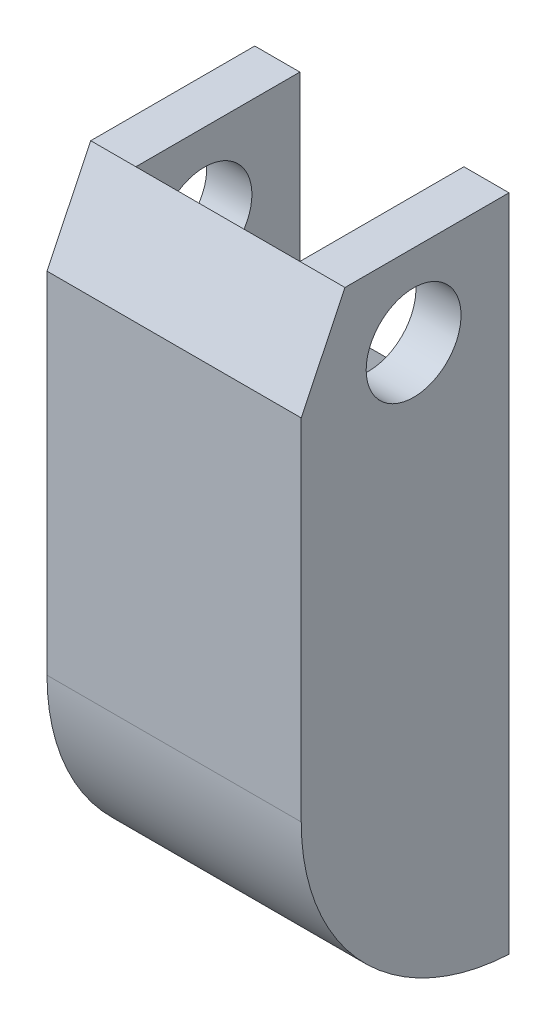
ISO-10303-21;
HEADER;
FILE_DESCRIPTION(('STEP AP214'),'2;1');
FILE_NAME('part.step','',(''),(''),'','','');
FILE_SCHEMA(('AUTOMOTIVE_DESIGN { 1 0 10303 214 1 1 1 1 }'));
ENDSEC;
DATA;
#1=APPLICATION_CONTEXT('core data for automotive mechanical design processes');
#2=APPLICATION_PROTOCOL_DEFINITION('international standard','automotive_design',2000,#1);
#3=PRODUCT_CONTEXT('',#1,'mechanical');
#4=PRODUCT('Part','Part','',(#3));
#5=PRODUCT_RELATED_PRODUCT_CATEGORY('part','',(#4));
#6=PRODUCT_DEFINITION_FORMATION('','',#4);
#7=PRODUCT_DEFINITION_CONTEXT('part definition',#1,'design');
#8=PRODUCT_DEFINITION('design','',#6,#7);
#9=PRODUCT_DEFINITION_SHAPE('','',#8);
#10=(LENGTH_UNIT() NAMED_UNIT(*) SI_UNIT(.MILLI.,.METRE.));
#11=(NAMED_UNIT(*) PLANE_ANGLE_UNIT() SI_UNIT($,.RADIAN.));
#12=(NAMED_UNIT(*) SI_UNIT($,.STERADIAN.) SOLID_ANGLE_UNIT());
#13=UNCERTAINTY_MEASURE_WITH_UNIT(LENGTH_MEASURE(1.E-05),#10,'distance_accuracy_value','');
#14=(GEOMETRIC_REPRESENTATION_CONTEXT(3) GLOBAL_UNCERTAINTY_ASSIGNED_CONTEXT((#13)) GLOBAL_UNIT_ASSIGNED_CONTEXT((#10,
#11,#12)) REPRESENTATION_CONTEXT('',''));
#15=CARTESIAN_POINT('',(0.,0.,0.));
#16=DIRECTION('',(0.,0.,1.));
#17=DIRECTION('',(1.,0.,0.));
#18=AXIS2_PLACEMENT_3D('',#15,#16,#17);
#19=CARTESIAN_POINT('',(0.,0.,7.62));
#20=DIRECTION('',(0.,0.,-1.));
#21=DIRECTION('',(-1.,0.,0.));
#22=AXIS2_PLACEMENT_3D('',#19,#20,#21);
#23=PLANE('',#22);
#24=DIRECTION('',(0.,-1.,0.));
#25=VECTOR('',#24,1.);
#26=CARTESIAN_POINT('',(9.7155,45.98924,7.62));
#27=LINE('',#26,#25);
#28=CARTESIAN_POINT('',(9.7155,30.63494,7.62));
#29=VERTEX_POINT('',#28);
#30=CARTESIAN_POINT('',(9.7155,26.82494,7.62));
#31=VERTEX_POINT('',#30);
#32=EDGE_CURVE('E188',#29,#31,#27,.T.);
#33=ORIENTED_EDGE('',*,*,#32,.T.);
#34=DIRECTION('',(1.,0.,0.));
#35=VECTOR('',#34,1.);
#36=CARTESIAN_POINT('',(-1.93222127853173,26.82494,7.62));
#37=LINE('',#36,#35);
#38=CARTESIAN_POINT('',(2.0955,26.82494,7.62));
#39=VERTEX_POINT('',#38);
#40=EDGE_CURVE('E141',#39,#31,#37,.T.);
#41=ORIENTED_EDGE('',*,*,#40,.F.);
#42=DIRECTION('',(0.,1.,0.));
#43=VECTOR('',#42,1.);
#44=CARTESIAN_POINT('',(2.0955,45.98924,7.62));
#45=LINE('',#44,#43);
#46=CARTESIAN_POINT('',(2.0955,30.63494,7.62));
#47=VERTEX_POINT('',#46);
#48=EDGE_CURVE('E146',#39,#47,#45,.T.);
#49=ORIENTED_EDGE('',*,*,#48,.T.);
#50=DIRECTION('',(-1.,0.,0.));
#51=VECTOR('',#50,1.);
#52=CARTESIAN_POINT('',(0.,30.63494,7.62));
#53=LINE('',#52,#51);
#54=EDGE_CURVE('E12',#29,#47,#53,.T.);
#55=ORIENTED_EDGE('',*,*,#54,.F.);
#56=EDGE_LOOP('',(#33,#41,#49,#55));
#57=FACE_BOUND('',#56,.T.);
#58=ADVANCED_FACE('F43',(#57),#23,.T.);
#59=CARTESIAN_POINT('',(11.811,0.,9.652));
#60=DIRECTION('',(-1.,0.,0.));
#61=DIRECTION('',(0.,0.,1.));
#62=AXIS2_PLACEMENT_3D('',#59,#60,#61);
#63=PLANE('',#62);
#64=CARTESIAN_POINT('',(11.811,26.82494,4.4323));
#65=DIRECTION('',(-1.,0.,0.));
#66=DIRECTION('',(0.,0.,1.));
#67=AXIS2_PLACEMENT_3D('',#64,#65,#66);
#68=CIRCLE('',#67,2.20345);
#69=CARTESIAN_POINT('',(11.811,26.82494,6.63575));
#70=VERTEX_POINT('',#69);
#71=EDGE_CURVE('E177',#70,#70,#68,.T.);
#72=ORIENTED_EDGE('',*,*,#71,.T.);
#73=EDGE_LOOP('',(#72));
#74=FACE_BOUND('',#73,.T.);
#75=DIRECTION('',(0.,1.,0.));
#76=VECTOR('',#75,1.);
#77=CARTESIAN_POINT('',(11.811,0.,0.));
#78=LINE('',#77,#76);
#79=CARTESIAN_POINT('',(11.811,0.,0.));
#80=VERTEX_POINT('',#79);
#81=CARTESIAN_POINT('',(11.811,30.63494,0.));
#82=VERTEX_POINT('',#81);
#83=EDGE_CURVE('E205',#80,#82,#78,.T.);
#84=ORIENTED_EDGE('',*,*,#83,.T.);
#85=DIRECTION('',(0.,0.,-1.));
#86=VECTOR('',#85,1.);
#87=CARTESIAN_POINT('',(11.811,30.63494,7.62));
#88=LINE('',#87,#86);
#89=CARTESIAN_POINT('',(11.811,30.63494,7.62));
#90=VERTEX_POINT('',#89);
#91=EDGE_CURVE('E158',#90,#82,#88,.T.);
#92=ORIENTED_EDGE('',*,*,#91,.F.);
#93=DIRECTION('',(0.,0.901435014436661,-0.432914442756968));
#94=VECTOR('',#93,1.);
#95=CARTESIAN_POINT('',(11.811,26.4038130880166,9.652));
#96=LINE('',#95,#94);
#97=CARTESIAN_POINT('',(11.811,26.4038130880166,9.652));
#98=VERTEX_POINT('',#97);
#99=EDGE_CURVE('E153',#98,#90,#96,.T.);
#100=ORIENTED_EDGE('',*,*,#99,.F.);
#101=DIRECTION('',(0.,1.,0.));
#102=VECTOR('',#101,1.);
#103=CARTESIAN_POINT('',(11.811,0.,9.652));
#104=LINE('',#103,#102);
#105=CARTESIAN_POINT('',(11.811,10.1472920525626,9.652));
#106=VERTEX_POINT('',#105);
#107=EDGE_CURVE('E196',#106,#98,#104,.T.);
#108=ORIENTED_EDGE('',*,*,#107,.F.);
#109=CARTESIAN_POINT('',(11.811,10.1472920525626,-0.508000000000002));
#110=DIRECTION('',(-1.,0.,0.));
#111=DIRECTION('',(0.,0.,1.));
#112=AXIS2_PLACEMENT_3D('',#109,#110,#111);
#113=CIRCLE('',#112,10.16);
#114=EDGE_CURVE('E214',#106,#80,#113,.F.);
#115=ORIENTED_EDGE('',*,*,#114,.T.);
#116=EDGE_LOOP('',(#84,#92,#100,#108,#115));
#117=FACE_BOUND('',#116,.T.);
#118=ADVANCED_FACE('F218',(#74,#117),#63,.F.);
#119=CARTESIAN_POINT('',(0.,0.,9.652));
#120=DIRECTION('',(-1.,0.,0.));
#121=DIRECTION('',(0.,0.,1.));
#122=AXIS2_PLACEMENT_3D('',#119,#120,#121);
#123=PLANE('',#122);
#124=DIRECTION('',(0.,0.,-1.));
#125=VECTOR('',#124,1.);
#126=CARTESIAN_POINT('',(0.,30.63494,7.62));
#127=LINE('',#126,#125);
#128=CARTESIAN_POINT('',(0.,30.63494,7.62));
#129=VERTEX_POINT('',#128);
#130=CARTESIAN_POINT('',(0.,30.63494,0.));
#131=VERTEX_POINT('',#130);
#132=EDGE_CURVE('E157',#129,#131,#127,.T.);
#133=ORIENTED_EDGE('',*,*,#132,.T.);
#134=DIRECTION('',(0.,1.,0.));
#135=VECTOR('',#134,1.);
#136=CARTESIAN_POINT('',(0.,0.,0.));
#137=LINE('',#136,#135);
#138=CARTESIAN_POINT('',(0.,0.,0.));
#139=VERTEX_POINT('',#138);
#140=EDGE_CURVE('E200',#139,#131,#137,.T.);
#141=ORIENTED_EDGE('',*,*,#140,.F.);
#142=CARTESIAN_POINT('',(0.,10.1472920525626,-0.508000000000002));
#143=DIRECTION('',(-1.,0.,0.));
#144=DIRECTION('',(0.,0.,1.));
#145=AXIS2_PLACEMENT_3D('',#142,#143,#144);
#146=CIRCLE('',#145,10.16);
#147=CARTESIAN_POINT('',(0.,10.1472920525626,9.652));
#148=VERTEX_POINT('',#147);
#149=EDGE_CURVE('E51',#139,#148,#146,.T.);
#150=ORIENTED_EDGE('',*,*,#149,.T.);
#151=DIRECTION('',(0.,1.,0.));
#152=VECTOR('',#151,1.);
#153=CARTESIAN_POINT('',(0.,0.,9.652));
#154=LINE('',#153,#152);
#155=CARTESIAN_POINT('',(0.,26.4038130880166,9.652));
#156=VERTEX_POINT('',#155);
#157=EDGE_CURVE('E199',#148,#156,#154,.T.);
#158=ORIENTED_EDGE('',*,*,#157,.T.);
#159=DIRECTION('',(0.,0.901435014436661,-0.432914442756968));
#160=VECTOR('',#159,1.);
#161=CARTESIAN_POINT('',(0.,26.4038130880166,9.652));
#162=LINE('',#161,#160);
#163=EDGE_CURVE('E154',#156,#129,#162,.T.);
#164=ORIENTED_EDGE('',*,*,#163,.T.);
#165=EDGE_LOOP('',(#133,#141,#150,#158,#164));
#166=FACE_BOUND('',#165,.T.);
#167=CARTESIAN_POINT('',(0.,26.82494,4.4323));
#168=DIRECTION('',(-1.,0.,0.));
#169=DIRECTION('',(0.,0.,1.));
#170=AXIS2_PLACEMENT_3D('',#167,#168,#169);
#171=CIRCLE('',#170,2.20345);
#172=CARTESIAN_POINT('',(0.,26.82494,6.63575));
#173=VERTEX_POINT('',#172);
#174=EDGE_CURVE('E184',#173,#173,#171,.T.);
#175=ORIENTED_EDGE('',*,*,#174,.F.);
#176=EDGE_LOOP('',(#175));
#177=FACE_BOUND('',#176,.T.);
#178=ADVANCED_FACE('F230',(#166,#177),#123,.T.);
#179=CARTESIAN_POINT('',(0.,0.,9.652));
#180=DIRECTION('',(0.,0.,1.));
#181=DIRECTION('',(1.,0.,0.));
#182=AXIS2_PLACEMENT_3D('',#179,#180,#181);
#183=PLANE('',#182);
#184=DIRECTION('',(1.,0.,0.));
#185=VECTOR('',#184,1.);
#186=CARTESIAN_POINT('',(0.,26.4038130880166,9.652));
#187=LINE('',#186,#185);
#188=EDGE_CURVE('E161',#156,#98,#187,.T.);
#189=ORIENTED_EDGE('',*,*,#188,.F.);
#190=ORIENTED_EDGE('',*,*,#157,.F.);
#191=DIRECTION('',(-1.,0.,0.));
#192=VECTOR('',#191,1.);
#193=CARTESIAN_POINT('',(11.811,10.1472920525626,9.652));
#194=LINE('',#193,#192);
#195=EDGE_CURVE('E202',#148,#106,#194,.F.);
#196=ORIENTED_EDGE('',*,*,#195,.T.);
#197=ORIENTED_EDGE('',*,*,#107,.T.);
#198=EDGE_LOOP('',(#189,#190,#196,#197));
#199=FACE_BOUND('',#198,.T.);
#200=ADVANCED_FACE('F229',(#199),#183,.T.);
#201=CARTESIAN_POINT('',(0.,0.,0.));
#202=DIRECTION('',(0.,0.,1.));
#203=DIRECTION('',(1.,0.,0.));
#204=AXIS2_PLACEMENT_3D('',#201,#202,#203);
#205=PLANE('',#204);
#206=DIRECTION('',(0.,1.,0.));
#207=VECTOR('',#206,1.);
#208=CARTESIAN_POINT('',(2.0955,45.98924,0.));
#209=LINE('',#208,#207);
#210=CARTESIAN_POINT('',(2.0955,21.1600760854083,0.));
#211=VERTEX_POINT('',#210);
#212=CARTESIAN_POINT('',(2.0955,30.63494,0.));
#213=VERTEX_POINT('',#212);
#214=EDGE_CURVE('E191',#211,#213,#209,.T.);
#215=ORIENTED_EDGE('',*,*,#214,.F.);
#216=DIRECTION('',(1.,0.,0.));
#217=VECTOR('',#216,1.);
#218=CARTESIAN_POINT('',(-3.6265634608912,21.1600760854083,0.));
#219=LINE('',#218,#217);
#220=CARTESIAN_POINT('',(9.7155,21.1600760854083,0.));
#221=VERTEX_POINT('',#220);
#222=EDGE_CURVE('E129',#211,#221,#219,.T.);
#223=ORIENTED_EDGE('',*,*,#222,.T.);
#224=DIRECTION('',(0.,-1.,0.));
#225=VECTOR('',#224,1.);
#226=CARTESIAN_POINT('',(9.7155,45.98924,0.));
#227=LINE('',#226,#225);
#228=CARTESIAN_POINT('',(9.7155,30.63494,0.));
#229=VERTEX_POINT('',#228);
#230=EDGE_CURVE('E187',#229,#221,#227,.T.);
#231=ORIENTED_EDGE('',*,*,#230,.F.);
#232=DIRECTION('',(1.,0.,0.));
#233=VECTOR('',#232,1.);
#234=CARTESIAN_POINT('',(0.,30.63494,0.));
#235=LINE('',#234,#233);
#236=EDGE_CURVE('E168',#229,#82,#235,.T.);
#237=ORIENTED_EDGE('',*,*,#236,.T.);
#238=ORIENTED_EDGE('',*,*,#83,.F.);
#239=DIRECTION('',(1.,0.,0.));
#240=VECTOR('',#239,1.);
#241=CARTESIAN_POINT('',(0.,0.,0.));
#242=LINE('',#241,#240);
#243=EDGE_CURVE('E193',#139,#80,#242,.T.);
#244=ORIENTED_EDGE('',*,*,#243,.F.);
#245=ORIENTED_EDGE('',*,*,#140,.T.);
#246=EDGE_CURVE('E164',#131,#213,#235,.T.);
#247=ORIENTED_EDGE('',*,*,#246,.T.);
#248=EDGE_LOOP('',(#215,#223,#231,#237,#238,#244,#245,#247));
#249=FACE_BOUND('',#248,.T.);
#250=ADVANCED_FACE('F225',(#249),#205,.F.);
#251=CARTESIAN_POINT('',(9.7155,45.98924,7.62));
#252=DIRECTION('',(1.,0.,0.));
#253=DIRECTION('',(0.,1.,0.));
#254=AXIS2_PLACEMENT_3D('',#251,#252,#253);
#255=PLANE('',#254);
#256=CARTESIAN_POINT('',(9.7155,26.82494,4.4323));
#257=DIRECTION('',(1.,0.,0.));
#258=DIRECTION('',(0.,1.,0.));
#259=AXIS2_PLACEMENT_3D('',#256,#257,#258);
#260=CIRCLE('',#259,2.20345);
#261=CARTESIAN_POINT('',(9.7155,29.02839,4.4323));
#262=VERTEX_POINT('',#261);
#263=EDGE_CURVE('E181',#262,#262,#260,.T.);
#264=ORIENTED_EDGE('',*,*,#263,.T.);
#265=EDGE_LOOP('',(#264));
#266=FACE_BOUND('',#265,.T.);
#267=DIRECTION('',(0.,-0.432914442756968,-0.901435014436661));
#268=VECTOR('',#267,1.);
#269=CARTESIAN_POINT('',(9.7155,17.1943622298093,-8.25759774589093));
#270=LINE('',#269,#268);
#271=CARTESIAN_POINT('',(9.7155,23.9514356044803,5.81230136917639));
#272=VERTEX_POINT('',#271);
#273=EDGE_CURVE('E133',#272,#221,#270,.T.);
#274=ORIENTED_EDGE('',*,*,#273,.F.);
#275=CARTESIAN_POINT('',(9.7155,26.82494,4.4323));
#276=DIRECTION('',(-1.,0.,0.));
#277=DIRECTION('',(0.,0.,1.));
#278=AXIS2_PLACEMENT_3D('',#275,#276,#277);
#279=CIRCLE('',#278,3.1877);
#280=EDGE_CURVE('E140',#272,#31,#279,.T.);
#281=ORIENTED_EDGE('',*,*,#280,.T.);
#282=ORIENTED_EDGE('',*,*,#32,.F.);
#283=DIRECTION('',(0.,0.,-1.));
#284=VECTOR('',#283,1.);
#285=CARTESIAN_POINT('',(9.7155,30.63494,7.62));
#286=LINE('',#285,#284);
#287=EDGE_CURVE('E174',#29,#229,#286,.T.);
#288=ORIENTED_EDGE('',*,*,#287,.T.);
#289=ORIENTED_EDGE('',*,*,#230,.T.);
#290=EDGE_LOOP('',(#274,#281,#282,#288,#289));
#291=FACE_BOUND('',#290,.T.);
#292=ADVANCED_FACE('F238',(#266,#291),#255,.F.);
#293=CARTESIAN_POINT('',(2.0955,45.98924,7.62));
#294=DIRECTION('',(-1.,0.,0.));
#295=DIRECTION('',(0.,-1.,0.));
#296=AXIS2_PLACEMENT_3D('',#293,#294,#295);
#297=PLANE('',#296);
#298=CARTESIAN_POINT('',(2.0955,26.82494,4.4323));
#299=DIRECTION('',(-1.,0.,0.));
#300=DIRECTION('',(0.,-1.,0.));
#301=AXIS2_PLACEMENT_3D('',#298,#299,#300);
#302=CIRCLE('',#301,2.20345);
#303=CARTESIAN_POINT('',(2.0955,24.62149,4.4323));
#304=VERTEX_POINT('',#303);
#305=EDGE_CURVE('E180',#304,#304,#302,.T.);
#306=ORIENTED_EDGE('',*,*,#305,.T.);
#307=EDGE_LOOP('',(#306));
#308=FACE_BOUND('',#307,.T.);
#309=ORIENTED_EDGE('',*,*,#48,.F.);
#310=CARTESIAN_POINT('',(2.0955,26.82494,4.4323));
#311=DIRECTION('',(-1.,0.,0.));
#312=DIRECTION('',(0.,-1.,0.));
#313=AXIS2_PLACEMENT_3D('',#310,#311,#312);
#314=CIRCLE('',#313,3.1877);
#315=CARTESIAN_POINT('',(2.0955,23.9514356044803,5.81230136917639));
#316=VERTEX_POINT('',#315);
#317=EDGE_CURVE('E137',#316,#39,#314,.T.);
#318=ORIENTED_EDGE('',*,*,#317,.F.);
#319=DIRECTION('',(0.,-0.432914442756968,-0.901435014436662));
#320=VECTOR('',#319,1.);
#321=CARTESIAN_POINT('',(2.0955,17.1943622298093,-8.25759774589093));
#322=LINE('',#321,#320);
#323=EDGE_CURVE('E122',#316,#211,#322,.T.);
#324=ORIENTED_EDGE('',*,*,#323,.T.);
#325=ORIENTED_EDGE('',*,*,#214,.T.);
#326=DIRECTION('',(0.,0.,1.));
#327=VECTOR('',#326,1.);
#328=CARTESIAN_POINT('',(2.0955,30.63494,7.62));
#329=LINE('',#328,#327);
#330=EDGE_CURVE('E167',#213,#47,#329,.T.);
#331=ORIENTED_EDGE('',*,*,#330,.T.);
#332=EDGE_LOOP('',(#309,#318,#324,#325,#331));
#333=FACE_BOUND('',#332,.T.);
#334=ADVANCED_FACE('F144',(#308,#333),#297,.F.);
#335=CARTESIAN_POINT('',(11.811,26.82494,4.4323));
#336=DIRECTION('',(-1.,0.,0.));
#337=DIRECTION('',(0.,0.,1.));
#338=AXIS2_PLACEMENT_3D('',#335,#336,#337);
#339=CYLINDRICAL_SURFACE('',#338,2.20345);
#340=ORIENTED_EDGE('',*,*,#174,.T.);
#341=EDGE_LOOP('',(#340));
#342=FACE_BOUND('',#341,.T.);
#343=ORIENTED_EDGE('',*,*,#305,.F.);
#344=EDGE_LOOP('',(#343));
#345=FACE_BOUND('',#344,.T.);
#346=ADVANCED_FACE('F257',(#342,#345),#339,.F.);
#347=ORIENTED_EDGE('',*,*,#71,.F.);
#348=EDGE_LOOP('',(#347));
#349=FACE_BOUND('',#348,.T.);
#350=ORIENTED_EDGE('',*,*,#263,.F.);
#351=EDGE_LOOP('',(#350));
#352=FACE_BOUND('',#351,.T.);
#353=ADVANCED_FACE('F253',(#349,#352),#339,.F.);
#354=CARTESIAN_POINT('',(0.,10.1472920525626,-0.508000000000002));
#355=DIRECTION('',(1.,0.,0.));
#356=DIRECTION('',(0.,0.,-1.));
#357=AXIS2_PLACEMENT_3D('',#354,#355,#356);
#358=CYLINDRICAL_SURFACE('',#357,10.16);
#359=ORIENTED_EDGE('',*,*,#149,.F.);
#360=ORIENTED_EDGE('',*,*,#243,.T.);
#361=ORIENTED_EDGE('',*,*,#114,.F.);
#362=ORIENTED_EDGE('',*,*,#195,.F.);
#363=EDGE_LOOP('',(#359,#360,#361,#362));
#364=FACE_BOUND('',#363,.T.);
#365=ADVANCED_FACE('F45',(#364),#358,.T.);
#366=CARTESIAN_POINT('',(0.,30.63494,7.62));
#367=DIRECTION('',(0.,-1.,0.));
#368=DIRECTION('',(0.,0.,-1.));
#369=AXIS2_PLACEMENT_3D('',#366,#367,#368);
#370=PLANE('',#369);
#371=DIRECTION('',(1.,0.,0.));
#372=VECTOR('',#371,1.);
#373=CARTESIAN_POINT('',(0.,30.63494,7.62));
#374=LINE('',#373,#372);
#375=EDGE_CURVE('E57',#29,#90,#374,.T.);
#376=ORIENTED_EDGE('',*,*,#375,.T.);
#377=ORIENTED_EDGE('',*,*,#91,.T.);
#378=ORIENTED_EDGE('',*,*,#236,.F.);
#379=ORIENTED_EDGE('',*,*,#287,.F.);
#380=EDGE_LOOP('',(#376,#377,#378,#379));
#381=FACE_BOUND('',#380,.T.);
#382=ADVANCED_FACE('F241',(#381),#370,.F.);
#383=ORIENTED_EDGE('',*,*,#246,.F.);
#384=ORIENTED_EDGE('',*,*,#132,.F.);
#385=EDGE_CURVE('E169',#129,#47,#374,.T.);
#386=ORIENTED_EDGE('',*,*,#385,.T.);
#387=ORIENTED_EDGE('',*,*,#330,.F.);
#388=EDGE_LOOP('',(#383,#384,#386,#387));
#389=FACE_BOUND('',#388,.T.);
#390=ADVANCED_FACE('F236',(#389),#370,.F.);
#391=CARTESIAN_POINT('',(0.,26.4038130880166,9.652));
#392=DIRECTION('',(0.,-0.432914442756968,-0.901435014436661));
#393=DIRECTION('',(0.,0.901435014436661,-0.432914442756968));
#394=AXIS2_PLACEMENT_3D('',#391,#392,#393);
#395=PLANE('',#394);
#396=ORIENTED_EDGE('',*,*,#99,.T.);
#397=ORIENTED_EDGE('',*,*,#375,.F.);
#398=ORIENTED_EDGE('',*,*,#54,.T.);
#399=ORIENTED_EDGE('',*,*,#385,.F.);
#400=ORIENTED_EDGE('',*,*,#163,.F.);
#401=ORIENTED_EDGE('',*,*,#188,.T.);
#402=EDGE_LOOP('',(#396,#397,#398,#399,#400,#401));
#403=FACE_BOUND('',#402,.T.);
#404=ADVANCED_FACE('F233',(#403),#395,.F.);
#405=CARTESIAN_POINT('',(-3.6265634608912,17.1943622298093,-8.25759774589093));
#406=DIRECTION('',(0.,-0.901435014436661,0.432914442756968));
#407=DIRECTION('',(0.,-0.432914442756968,-0.901435014436661));
#408=AXIS2_PLACEMENT_3D('',#405,#406,#407);
#409=PLANE('',#408);
#410=ORIENTED_EDGE('',*,*,#323,.F.);
#411=DIRECTION('',(1.,0.,0.));
#412=VECTOR('',#411,1.);
#413=CARTESIAN_POINT('',(-1.93222127853173,23.9514356044803,5.81230136917639));
#414=LINE('',#413,#412);
#415=EDGE_CURVE('E126',#316,#272,#414,.T.);
#416=ORIENTED_EDGE('',*,*,#415,.T.);
#417=ORIENTED_EDGE('',*,*,#273,.T.);
#418=ORIENTED_EDGE('',*,*,#222,.F.);
#419=EDGE_LOOP('',(#410,#416,#417,#418));
#420=FACE_BOUND('',#419,.T.);
#421=ADVANCED_FACE('F124',(#420),#409,.F.);
#422=CARTESIAN_POINT('',(-1.93222127853173,26.82494,4.4323));
#423=DIRECTION('',(1.,0.,0.));
#424=DIRECTION('',(0.,1.,0.));
#425=AXIS2_PLACEMENT_3D('',#422,#423,#424);
#426=CYLINDRICAL_SURFACE('',#425,3.1877);
#427=ORIENTED_EDGE('',*,*,#415,.F.);
#428=ORIENTED_EDGE('',*,*,#317,.T.);
#429=ORIENTED_EDGE('',*,*,#40,.T.);
#430=ORIENTED_EDGE('',*,*,#280,.F.);
#431=EDGE_LOOP('',(#427,#428,#429,#430));
#432=FACE_BOUND('',#431,.T.);
#433=ADVANCED_FACE('F136',(#432),#426,.F.);
#434=CLOSED_SHELL('',(#58,#118,#178,#200,#250,#292,#334,#346,#353,#365,#382,#390,#404,#421,#433));
#435=MANIFOLD_SOLID_BREP('B2',#434);
#436=ADVANCED_BREP_SHAPE_REPRESENTATION('',(#18,#435),#14);
#437=SHAPE_DEFINITION_REPRESENTATION(#9,#436);
ENDSEC;
END-ISO-10303-21;
